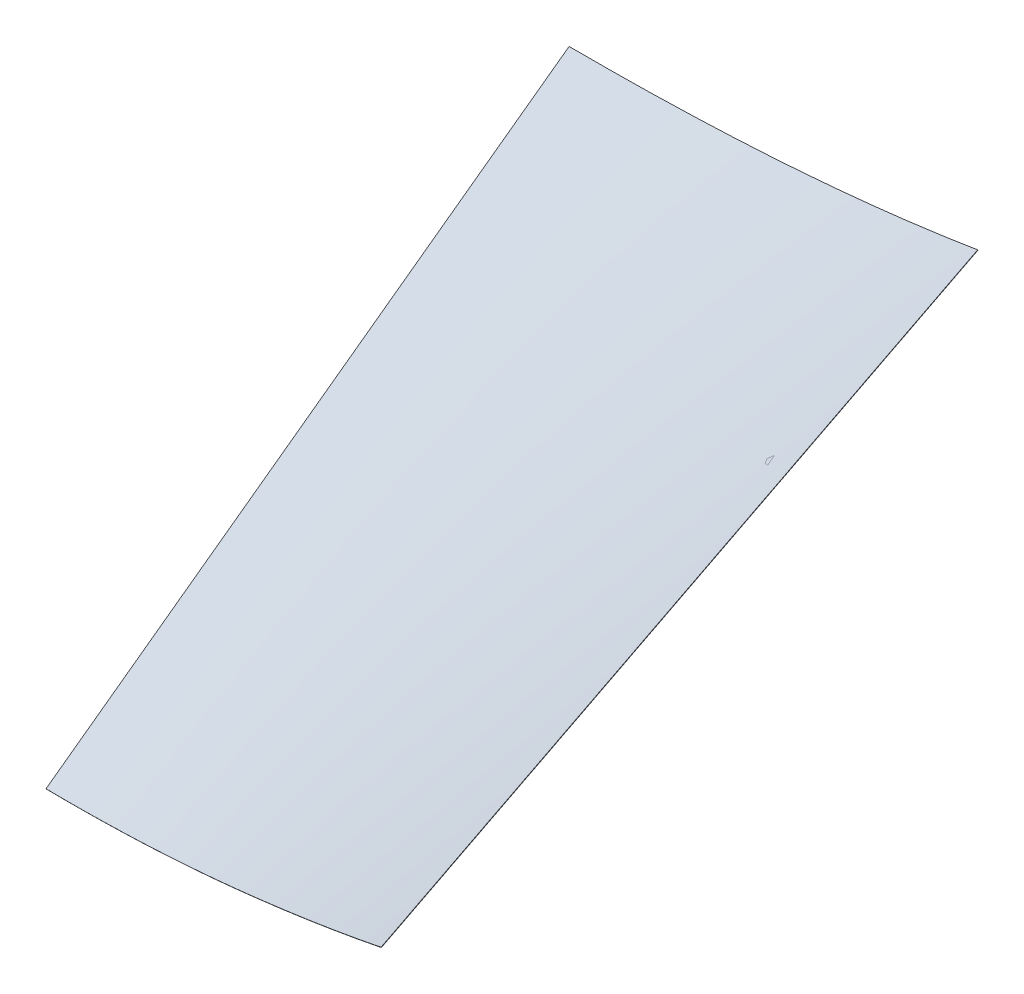
ISO-10303-21;
HEADER;
FILE_DESCRIPTION(('STEP AP214'),'2;1');
FILE_NAME('part.step','',(''),(''),'','','');
FILE_SCHEMA(('AUTOMOTIVE_DESIGN { 1 0 10303 214 1 1 1 1 }'));
ENDSEC;
DATA;
#1=APPLICATION_CONTEXT('core data for automotive mechanical design processes');
#2=APPLICATION_PROTOCOL_DEFINITION('international standard','automotive_design',2000,#1);
#3=PRODUCT_CONTEXT('',#1,'mechanical');
#4=PRODUCT('Part','Part','',(#3));
#5=PRODUCT_RELATED_PRODUCT_CATEGORY('part','',(#4));
#6=PRODUCT_DEFINITION_FORMATION('','',#4);
#7=PRODUCT_DEFINITION_CONTEXT('part definition',#1,'design');
#8=PRODUCT_DEFINITION('design','',#6,#7);
#9=PRODUCT_DEFINITION_SHAPE('','',#8);
#10=(LENGTH_UNIT() NAMED_UNIT(*) SI_UNIT(.MILLI.,.METRE.));
#11=(NAMED_UNIT(*) PLANE_ANGLE_UNIT() SI_UNIT($,.RADIAN.));
#12=(NAMED_UNIT(*) SI_UNIT($,.STERADIAN.) SOLID_ANGLE_UNIT());
#13=UNCERTAINTY_MEASURE_WITH_UNIT(LENGTH_MEASURE(1.E-05),#10,'distance_accuracy_value','');
#14=(GEOMETRIC_REPRESENTATION_CONTEXT(3) GLOBAL_UNCERTAINTY_ASSIGNED_CONTEXT((#13)) GLOBAL_UNIT_ASSIGNED_CONTEXT((#10,
#11,#12)) REPRESENTATION_CONTEXT('',''));
#15=CARTESIAN_POINT('',(0.,0.,0.));
#16=DIRECTION('',(0.,0.,1.));
#17=DIRECTION('',(1.,0.,0.));
#18=AXIS2_PLACEMENT_3D('',#15,#16,#17);
#19=CARTESIAN_POINT('',(-38.1499886062801,-1161.0080507242,1107.07655239869));
#20=CARTESIAN_POINT('',(-28.3698605992159,-1161.49242844966,1106.7179892266));
#21=CARTESIAN_POINT('',(-18.5803893052874,-1161.83673353649,1106.46310877334));
#22=CARTESIAN_POINT('',(1.01817256580119,-1162.23015300503,1106.17185441453));
#23=CARTESIAN_POINT('',(10.8276556057234,-1162.27729652267,1106.13693988012));
#24=CARTESIAN_POINT('',(40.2795059807348,-1161.9790850881,1106.35762286069));
#25=CARTESIAN_POINT('',(59.9451526862877,-1161.19744574197,1106.93616154347));
#26=CARTESIAN_POINT('',(118.976834691719,-1157.24545948258,1109.86126642328));
#27=CARTESIAN_POINT('',(158.3775793792,-1152.4680674079,1113.39730016528));
#28=CARTESIAN_POINT('',(276.252502196664,-1132.8384308102,1127.92572399571));
#29=CARTESIAN_POINT('',(354.399459277357,-1112.68894982968,1142.83817079136));
#30=CARTESIAN_POINT('',(469.104995003831,-1076.38776027423,1169.70226736042));
#31=CARTESIAN_POINT('',(506.921029003011,-1063.27447399166,1179.40627375934));
#32=CARTESIAN_POINT('',(553.473194657516,-1046.08704206374,1192.12484661789));
#33=CARTESIAN_POINT('',(562.747733192783,-1042.60976408366,1194.6979899312));
#34=CARTESIAN_POINT('',(581.220169268713,-1035.58738084722,1199.8944339847));
#35=CARTESIAN_POINT('',(590.417591559904,-1032.04305200869,1202.51715968828));
#36=CARTESIAN_POINT('',(617.895384255526,-1021.31418635607,1210.4562249209));
#37=CARTESIAN_POINT('',(636.061814422847,-1014.03275523264,1215.8442071235));
#38=CARTESIAN_POINT('',(726.176434926162,-976.994662944125,1243.25060966637));
#39=CARTESIAN_POINT('',(795.972024077284,-945.345133882044,1266.66842263182));
#40=CARTESIAN_POINT('',(864.021551677036,-911.847212487094,1291.45250542573));
#41=CARTESIAN_POINT('',(-38.1000000001121,-1160.35247008225,1107.55442162887));
#42=CARTESIAN_POINT('',(-28.3295038712985,-1160.83653412831,1107.19643569007));
#43=CARTESIAN_POINT('',(-18.5499374122105,-1161.18060655798,1106.94197950239));
#44=CARTESIAN_POINT('',(1.02830843663519,-1161.57376215261,1106.65122422779));
#45=CARTESIAN_POINT('',(10.8274162262114,-1161.62088017615,1106.61637844647));
#46=CARTESIAN_POINT('',(40.2492727833644,-1161.32290472367,1106.83674396001));
#47=CARTESIAN_POINT('',(59.8958265114803,-1160.54182222729,1107.41438766858));
#48=CARTESIAN_POINT('',(118.873099558641,-1156.59232326558,1110.33521003725));
#49=CARTESIAN_POINT('',(158.2414307405,-1151.81765532767,1113.86627994035));
#50=CARTESIAN_POINT('',(276.030182079502,-1132.19700651634,1128.37658377676));
#51=CARTESIAN_POINT('',(354.134360030071,-1112.05438064529,1143.2729118372));
#52=CARTESIAN_POINT('',(468.791383911466,-1075.76059541417,1170.11370880274));
#53=CARTESIAN_POINT('',(506.593851364521,-1062.64935926637,1179.8100252704));
#54=CARTESIAN_POINT('',(553.131806022483,-1045.46382978179,1192.5194548519));
#55=CARTESIAN_POINT('',(562.403640471157,-1041.98689966988,1195.09079246804));
#56=CARTESIAN_POINT('',(580.870935052068,-1034.96514477538,1200.28367869539));
#57=CARTESIAN_POINT('',(590.065899335466,-1031.42110420181,1202.90464735069));
#58=CARTESIAN_POINT('',(617.536271038952,-1020.69317464022,1210.83840728754));
#59=CARTESIAN_POINT('',(635.697834433342,-1013.41240691151,1216.22284451598));
#60=CARTESIAN_POINT('',(725.788559645226,-976.377799013707,1243.61151133465));
#61=CARTESIAN_POINT('',(795.566446182503,-944.731651081751,1267.01518295429));
#62=CARTESIAN_POINT('',(863.59999999974,-911.237335089981,1291.78565341665));
#63=B_SPLINE_SURFACE_WITH_KNOTS('',1,3,((#19,#20,#21,#22,#23,#24,#25,#26,#27,#28,#29,#30,#31,
#32,#33,#34,#35,#36,#37,#38,#39,#40),(#41,#42,#43,#44,#45,#46,#47,#48,#49,#50,#51,#52,#53,#54,
#55,#56,#57,#58,#59,#60,#61,#62)),.UNSPECIFIED.,.F.,.F.,.F.,(2,2),(4,2,2,2,2,2,2,2,2,2,4),(0.,
1.),(0.,0.03125,0.0625,0.125,0.25,0.5,0.625,0.65625,0.6875,0.75,1.),.UNSPECIFIED.);
#64=CARTESIAN_POINT('',(863.59999999974,-911.237335089981,1291.78565341665));
#65=CARTESIAN_POINT('',(864.021551677036,-911.847212487094,1291.45250542573));
#66=B_SPLINE_CURVE_WITH_KNOTS('',1,(#64,#65),.UNSPECIFIED.,.F.,.F.,(2,2),(0.,1.),.UNSPECIFIED.);
#67=CARTESIAN_POINT('',(863.59999999974,-911.237335089981,1291.78565341665));
#68=VERTEX_POINT('',#67);
#69=CARTESIAN_POINT('',(864.021551677036,-911.847212487094,1291.45250542573));
#70=VERTEX_POINT('',#69);
#71=EDGE_CURVE('E14',#68,#70,#66,.T.);
#72=CARTESIAN_POINT('',(863.59999999974,-911.237335089981,1291.78565341665));
#73=CARTESIAN_POINT('',(795.566446182503,-944.731651081751,1267.01518295429));
#74=CARTESIAN_POINT('',(725.788559645226,-976.377799013707,1243.61151133465));
#75=CARTESIAN_POINT('',(635.697834433342,-1013.41240691151,1216.22284451598));
#76=CARTESIAN_POINT('',(617.536271038952,-1020.69317464022,1210.83840728754));
#77=CARTESIAN_POINT('',(590.065899335466,-1031.42110420181,1202.90464735069));
#78=CARTESIAN_POINT('',(580.870935052068,-1034.96514477538,1200.28367869539));
#79=CARTESIAN_POINT('',(562.403640471157,-1041.98689966988,1195.09079246804));
#80=CARTESIAN_POINT('',(553.131806022483,-1045.46382978179,1192.5194548519));
#81=CARTESIAN_POINT('',(506.593851364521,-1062.64935926637,1179.8100252704));
#82=CARTESIAN_POINT('',(468.791383911466,-1075.76059541417,1170.11370880274));
#83=CARTESIAN_POINT('',(354.134360030071,-1112.05438064529,1143.2729118372));
#84=CARTESIAN_POINT('',(276.030182079502,-1132.19700651634,1128.37658377676));
#85=CARTESIAN_POINT('',(158.2414307405,-1151.81765532767,1113.86627994035));
#86=CARTESIAN_POINT('',(118.873099558641,-1156.59232326558,1110.33521003725));
#87=CARTESIAN_POINT('',(59.8958265114803,-1160.54182222729,1107.41438766858));
#88=CARTESIAN_POINT('',(40.2492727833644,-1161.32290472367,1106.83674396001));
#89=CARTESIAN_POINT('',(10.8274162262114,-1161.62088017615,1106.61637844647));
#90=CARTESIAN_POINT('',(1.02830843663519,-1161.57376215261,1106.65122422779));
#91=CARTESIAN_POINT('',(-18.5499374122105,-1161.18060655798,1106.94197950239));
#92=CARTESIAN_POINT('',(-28.3295038712985,-1160.83653412831,1107.19643569007));
#93=CARTESIAN_POINT('',(-38.1000000001121,-1160.35247008225,1107.55442162887));
#94=B_SPLINE_CURVE_WITH_KNOTS('',3,(#72,#73,#74,#75,#76,#77,#78,#79,#80,#81,#82,#83,#84,#85,#86,
#87,#88,#89,#90,#91,#92,#93),.UNSPECIFIED.,.F.,.F.,(4,2,2,2,2,2,2,2,2,2,4),(0.,0.25,0.3125,
0.34375,0.375,0.5,0.75,0.875,0.9375,0.96875,1.),.UNSPECIFIED.);
#95=CARTESIAN_POINT('',(-38.1000000001121,-1160.35247008225,1107.55442162887));
#96=VERTEX_POINT('',#95);
#97=EDGE_CURVE('E124',#68,#96,#94,.T.);
#98=CARTESIAN_POINT('',(-38.1000000001121,-1160.35247008225,1107.55442162887));
#99=CARTESIAN_POINT('',(-38.1499886062801,-1161.0080507242,1107.07655239869));
#100=B_SPLINE_CURVE_WITH_KNOTS('',1,(#98,#99),.UNSPECIFIED.,.F.,.F.,(2,2),(0.,1.),.UNSPECIFIED.);
#101=CARTESIAN_POINT('',(-38.149988136834,-1161.00805074745,1107.07655238148));
#102=VERTEX_POINT('',#101);
#103=EDGE_CURVE('E73',#96,#102,#100,.T.);
#104=CARTESIAN_POINT('',(864.021551677022,-911.847212487096,1291.45250542571));
#105=CARTESIAN_POINT('',(846.991448379126,-920.230675321087,1285.2498389563));
#106=CARTESIAN_POINT('',(829.866994424443,-928.490476265819,1279.13858601375));
#107=CARTESIAN_POINT('',(795.383151194075,-944.774409960295,1267.09028737735));
#108=CARTESIAN_POINT('',(778.023250665233,-952.797842713063,1261.15375916611));
#109=CARTESIAN_POINT('',(743.051081954765,-968.603840753451,1249.45875947928));
#110=CARTESIAN_POINT('',(725.438124779831,-976.385422056958,1243.70101546652));
#111=CARTESIAN_POINT('',(698.848755893684,-987.859615103853,1235.21091243888));
#112=CARTESIAN_POINT('',(689.94237363754,-991.657459460077,1232.40075127906));
#113=CARTESIAN_POINT('',(672.060075896384,-999.190902042924,1226.82644542188));
#114=CARTESIAN_POINT('',(663.084041236822,-1002.92631759315,1224.06243578743));
#115=CARTESIAN_POINT('',(645.06035606368,-1010.33426402736,1218.58091200075));
#116=CARTESIAN_POINT('',(636.01257567951,-1014.00659064761,1215.86354889298));
#117=CARTESIAN_POINT('',(617.843190241421,-1021.28762340955,1210.47586188345));
#118=CARTESIAN_POINT('',(608.721444467279,-1024.8961026206,1207.80570578767));
#119=CARTESIAN_POINT('',(590.402246312967,-1032.04914643048,1202.51264968553));
#120=CARTESIAN_POINT('',(581.204643704044,-1035.59346231094,1199.88993359581));
#121=CARTESIAN_POINT('',(562.734039897776,-1042.61478973817,1194.69427124228));
#122=CARTESIAN_POINT('',(553.460892132033,-1046.09155241528,1192.12150902913));
#123=CARTESIAN_POINT('',(539.505001291604,-1051.24422673472,1188.30856797985));
#124=CARTESIAN_POINT('',(534.840971836436,-1052.95293742014,1187.04413050022));
#125=CARTESIAN_POINT('',(525.495591829538,-1056.34902951643,1184.53103078738));
#126=CARTESIAN_POINT('',(520.814229054208,-1058.03638918663,1183.28238463427));
#127=CARTESIAN_POINT('',(506.740892559966,-1063.06573490379,1179.56065639225));
#128=CARTESIAN_POINT('',(497.328878636977,-1066.37158323478,1177.11430376876));
#129=CARTESIAN_POINT('',(478.442748406051,-1072.88033947338,1172.29774252344));
#130=CARTESIAN_POINT('',(468.968596263537,-1076.08318026447,1169.92758354745));
#131=CARTESIAN_POINT('',(449.963103850289,-1082.37402030492,1165.2722180213));
#132=CARTESIAN_POINT('',(440.431771765182,-1085.46203555712,1162.98699963328));
#133=CARTESIAN_POINT('',(411.777911454569,-1094.53027025539,1156.27620205165));
#134=CARTESIAN_POINT('',(392.563923814881,-1100.32563540825,1151.98737228626));
#135=CARTESIAN_POINT('',(353.962935798839,-1111.31489451913,1143.8547082633));
#136=CARTESIAN_POINT('',(334.577026948813,-1116.5112550784,1140.00904912407));
#137=CARTESIAN_POINT('',(295.669931846597,-1126.20671155027,1132.83364498383));
#138=CARTESIAN_POINT('',(276.150372612544,-1130.71000287455,1129.5007957818));
#139=CARTESIAN_POINT('',(237.012284181131,-1138.92364493373,1123.42185382362));
#140=CARTESIAN_POINT('',(217.395682444697,-1142.63984892252,1120.67142983547));
#141=CARTESIAN_POINT('',(187.866856611153,-1147.55722223888,1117.03194925589));
#142=CARTESIAN_POINT('',(178.037365473094,-1149.08311626113,1115.90258437016));
#143=CARTESIAN_POINT('',(158.368966137301,-1151.90151278489,1113.81658120073));
#144=CARTESIAN_POINT('',(148.530270968612,-1153.19496881825,1112.85923723617));
#145=CARTESIAN_POINT('',(128.848563122078,-1155.53663711402,1111.12605496591));
#146=CARTESIAN_POINT('',(119.005730741081,-1156.58582539044,1110.34949431015));
#147=CARTESIAN_POINT('',(99.3206436353137,-1158.42716932139,1108.98661119996));
#148=CARTESIAN_POINT('',(89.4785284342422,-1159.22028516715,1108.39957807709));
#149=CARTESIAN_POINT('',(69.7994676197702,-1160.5377237854,1107.42446180583));
#150=CARTESIAN_POINT('',(59.9626164847236,-1161.06294391689,1107.0357144679));
#151=CARTESIAN_POINT('',(45.2057165027884,-1161.64079078829,1106.60802011264));
#152=CARTESIAN_POINT('',(40.2917528202373,-1161.79835230299,1106.49140187025));
#153=CARTESIAN_POINT('',(30.4670274877195,-1162.04198384417,1106.31108317932));
#154=CARTESIAN_POINT('',(25.556269258543,-1162.12814096348,1106.24731826491));
#155=CARTESIAN_POINT('',(15.7386306820452,-1162.22759358792,1106.17372112805));
#156=CARTESIAN_POINT('',(10.8317515026811,-1162.24096349057,1106.16383383603));
#157=CARTESIAN_POINT('',(1.0224922870287,-1162.1930169901,1106.19934339257));
#158=CARTESIAN_POINT('',(-3.87988819287532,-1162.13176066596,1106.24469576959));
#159=CARTESIAN_POINT('',(-13.6797366638892,-1161.93517786812,1106.39022892732));
#160=CARTESIAN_POINT('',(-18.5772058819173,-1161.79989056784,1106.49038071097));
#161=CARTESIAN_POINT('',(-28.3673552104501,-1161.45738593482,1106.74392793311));
#162=CARTESIAN_POINT('',(-33.2600360356875,-1161.25018182601,1106.89731358304));
#163=CARTESIAN_POINT('',(-38.1499881368117,-1161.00805074746,1107.07655238149));
#164=B_SPLINE_CURVE_WITH_KNOTS('',3,(#104,#105,#106,#107,#108,#109,#110,#111,#112,#113,#114,
#115,#116,#117,#118,#119,#120,#121,#122,#123,#124,#125,#126,#127,#128,#129,#130,#131,#132,#133,
#134,#135,#136,#137,#138,#139,#140,#141,#142,#143,#144,#145,#146,#147,#148,#149,#150,#151,#152,
#153,#154,#155,#156,#157,#158,#159,#160,#161,#162,#163),.UNSPECIFIED.,.F.,.F.,(4,2,2,2,2,2,2,2,
2,2,2,2,2,2,2,2,2,2,2,2,2,2,2,2,2,2,2,2,2,4),(0.,59.9078035301592,119.97810147105,
180.267239793652,210.512462204246,240.83453309363,271.241107909605,301.739972295622,
332.338962432425,363.034916755443,378.411599361161,393.802849602651,424.615753662604,
455.448343645604,486.276620366178,547.829987864584,609.120078002313,670.023178250112,
730.456094651352,760.486084552519,790.389920693558,820.17213768124,849.841347553648,
879.410512087185,894.163468452529,908.898403858307,923.618275510888,938.326304535497,
953.026558336055,967.724110510313),.UNSPECIFIED.);
#165=EDGE_CURVE('E301',#70,#102,#164,.T.);
#166=ORIENTED_EDGE('',*,*,#71,.F.);
#167=ORIENTED_EDGE('',*,*,#97,.T.);
#168=ORIENTED_EDGE('',*,*,#103,.T.);
#169=ORIENTED_EDGE('',*,*,#165,.F.);
#170=EDGE_LOOP('',(#166,#167,#168,#169));
#171=FACE_BOUND('',#170,.T.);
#172=ADVANCED_FACE('F59',(#171),#63,.F.);
#173=CARTESIAN_POINT('',(-38.1499886062801,-1161.0080507242,1107.07655239869));
#174=CARTESIAN_POINT('',(-38.1367174604385,-888.835354328298,733.686086637298));
#175=CARTESIAN_POINT('',(-38.1238502804513,-616.662374036575,360.295827814729));
#176=CARTESIAN_POINT('',(-38.1113921318659,-344.489157937577,-13.0942591219789));
#177=CARTESIAN_POINT('',(-38.1000000001121,-1160.35247008225,1107.55442162887));
#178=CARTESIAN_POINT('',(-38.0999999998941,-888.179112865116,734.164437556715));
#179=CARTESIAN_POINT('',(-38.0999999996761,-616.005755647983,360.774453484564));
#180=CARTESIAN_POINT('',(-38.0999999994581,-343.832398430848,-12.6155305875886));
#181=B_SPLINE_SURFACE_WITH_KNOTS('',1,3,((#173,#174,#175,#176),(#177,#178,#179,#180)),
.UNSPECIFIED.,.F.,.F.,.F.,(2,2),(4,4),(0.,1.),(-0.693088332981127,0.693088332981127),.UNSPECIFIED.);
#182=CARTESIAN_POINT('',(-38.1000000001121,-1160.35247008225,1107.55442162887));
#183=CARTESIAN_POINT('',(-38.0999999998941,-888.179112865116,734.164437556715));
#184=CARTESIAN_POINT('',(-38.0999999996761,-616.005755647983,360.774453484564));
#185=CARTESIAN_POINT('',(-38.0999999994581,-343.832398430848,-12.6155305875886));
#186=B_SPLINE_CURVE_WITH_KNOTS('',3,(#182,#183,#184,#185),.UNSPECIFIED.,.F.,.F.,(4,4),
(-0.693088332981127,0.693088332981127),.UNSPECIFIED.);
#187=CARTESIAN_POINT('',(-38.0999999994581,-343.832398430848,-12.6155305875886));
#188=VERTEX_POINT('',#187);
#189=EDGE_CURVE('E299',#96,#188,#186,.T.);
#190=CARTESIAN_POINT('',(-38.0999999994581,-343.832398430848,-12.6155305875886));
#191=CARTESIAN_POINT('',(-38.1113921318659,-344.489157937577,-13.0942591219789));
#192=B_SPLINE_CURVE_WITH_KNOTS('',1,(#190,#191),.UNSPECIFIED.,.F.,.F.,(2,2),(0.,1.),.UNSPECIFIED.);
#193=CARTESIAN_POINT('',(-38.1113921318846,-344.489158345837,-13.0942585618937));
#194=VERTEX_POINT('',#193);
#195=EDGE_CURVE('E113',#188,#194,#192,.T.);
#196=CARTESIAN_POINT('',(-38.1499886061275,-1161.00805072421,1107.07655239868));
#197=CARTESIAN_POINT('',(-38.1483297117881,-1126.98646369153,1060.40274420222));
#198=CARTESIAN_POINT('',(-38.1466771157453,-1092.96487221842,1013.72893924227));
#199=CARTESIAN_POINT('',(-38.143384556249,-1024.92168058453,920.381335655025));
#200=CARTESIAN_POINT('',(-38.1417445927954,-990.900080423751,873.707537027737));
#201=CARTESIAN_POINT('',(-38.1384773344729,-922.856871607525,780.359945965148));
#202=CARTESIAN_POINT('',(-38.1368500396041,-888.835262952076,733.686153529848));
#203=CARTESIAN_POINT('',(-38.1336081462791,-820.792037337241,640.338574712181));
#204=CARTESIAN_POINT('',(-38.131993547823,-786.770420377856,593.664788329814));
#205=CARTESIAN_POINT('',(-38.1287770702163,-718.72717834414,500.317221480288));
#206=CARTESIAN_POINT('',(-38.1271751910657,-684.705553269811,453.64344101313));
#207=CARTESIAN_POINT('',(-38.1239841682166,-616.662295193144,360.29588585772));
#208=CARTESIAN_POINT('',(-38.1223950245179,-582.640662190807,313.622111169468));
#209=CARTESIAN_POINT('',(-38.119229484061,-514.597388443191,220.27456743699));
#210=CARTESIAN_POINT('',(-38.1176530873026,-480.575747697912,173.600798392765));
#211=CARTESIAN_POINT('',(-38.1145130450608,-412.532458646771,80.2532658154118));
#212=CARTESIAN_POINT('',(-38.1129493995773,-378.510810340909,33.5795022822832));
#213=CARTESIAN_POINT('',(-38.1113921318987,-344.489158345833,-13.0942585618997));
#214=B_SPLINE_CURVE_WITH_KNOTS('',3,(#196,#197,#198,#199,#200,#201,#202,#203,#204,#205,#206,
#207,#208,#209,#210,#211,#212,#213),.UNSPECIFIED.,.F.,.F.,(4,2,2,2,2,2,2,2,4),(0.,
173.272083229835,346.544166458521,519.816249686068,693.088332912546,866.360416137876,
1039.63249936217,1212.90458258539,1386.17666580757),.UNSPECIFIED.);
#215=EDGE_CURVE('E134',#102,#194,#214,.T.);
#216=ORIENTED_EDGE('',*,*,#103,.F.);
#217=ORIENTED_EDGE('',*,*,#189,.T.);
#218=ORIENTED_EDGE('',*,*,#195,.T.);
#219=ORIENTED_EDGE('',*,*,#215,.F.);
#220=EDGE_LOOP('',(#216,#217,#218,#219));
#221=FACE_BOUND('',#220,.T.);
#222=ADVANCED_FACE('F158',(#221),#181,.T.);
#223=CARTESIAN_POINT('',(-38.1113921318659,-344.489157937577,-13.0942591219789));
#224=CARTESIAN_POINT('',(2.34657230488643,-344.986214440813,-13.3751195559739));
#225=CARTESIAN_POINT('',(42.7240325935585,-344.690919388901,-13.2088396489773));
#226=CARTESIAN_POINT('',(123.319431538469,-342.531221424864,-11.9910711773869));
#227=CARTESIAN_POINT('',(163.537404802124,-340.66709860637,-10.9397911469516));
#228=CARTESIAN_POINT('',(243.815031871022,-335.380517780352,-7.95883000248485));
#229=CARTESIAN_POINT('',(283.87460751026,-331.957398895512,-6.02877801816092));
#230=CARTESIAN_POINT('',(363.835695568645,-323.555594827901,-1.29246599809944));
#231=CARTESIAN_POINT('',(403.737201367728,-318.57658801898,1.51397476011851));
#232=CARTESIAN_POINT('',(483.381545039883,-307.057062461361,8.00579681296864));
#233=CARTESIAN_POINT('',(523.124459564965,-300.517249069255,11.6907812971803));
#234=CARTESIAN_POINT('',(602.450448141265,-285.864225178705,19.9458083506498));
#235=CARTESIAN_POINT('',(642.033523790623,-277.75121211723,24.5157036959996));
#236=CARTESIAN_POINT('',(686.473519881027,-267.728843596813,30.1602980643572));
#237=CARTESIAN_POINT('',(691.410075870621,-266.602797557578,30.7944768649571));
#238=CARTESIAN_POINT('',(701.280475229855,-264.325813340226,32.0768339993813));
#239=CARTESIAN_POINT('',(706.213909004898,-263.174963169399,32.7249626464872));
#240=CARTESIAN_POINT('',(720.99568472751,-259.688505910376,34.6884174900149));
#241=CARTESIAN_POINT('',(730.824982307017,-257.319120664236,36.02273992793));
#242=CARTESIAN_POINT('',(760.245311682603,-250.074935639943,40.1022075537145));
#243=CARTESIAN_POINT('',(779.765728959614,-245.064777139743,42.9234758613329));
#244=CARTESIAN_POINT('',(838.051406324731,-229.499696853385,51.6879235407297));
#245=CARTESIAN_POINT('',(876.541207886824,-218.410297762879,57.9316760840266));
#246=CARTESIAN_POINT('',(914.671731224014,-206.62390026416,64.5673705536613));
#247=CARTESIAN_POINT('',(-38.0999999994581,-343.832398430848,-12.6155305875886));
#248=CARTESIAN_POINT('',(2.34587496324093,-344.329960485962,-12.8954097746801));
#249=CARTESIAN_POINT('',(42.7112630313482,-344.034662193241,-12.7293041698282));
#250=CARTESIAN_POINT('',(123.28255233771,-341.874093742574,-11.5139821101718));
#251=CARTESIAN_POINT('',(163.488503500891,-340.009130503825,-10.4649382977443));
#252=CARTESIAN_POINT('',(243.74209392101,-334.720431403832,-7.49003940892614));
#253=CARTESIAN_POINT('',(283.789666184797,-331.296035913818,-5.56381329064884));
#254=CARTESIAN_POINT('',(363.726817259782,-322.891607873523,-0.836313547232498));
#255=CARTESIAN_POINT('',(403.61636377478,-317.911257328022,1.96513895055722));
#256=CARTESIAN_POINT('',(483.236893543718,-306.38930872168,8.44624733996641));
#257=CARTESIAN_POINT('',(522.96794847311,-299.848416392546,12.1255062567464));
#258=CARTESIAN_POINT('',(602.270317030323,-285.193784982088,20.3687520672457));
#259=CARTESIAN_POINT('',(641.841651959498,-277.080255638372,24.9326209833358));
#260=CARTESIAN_POINT('',(686.268518660841,-267.057661205714,30.5703410496611));
#261=CARTESIAN_POINT('',(691.203617801813,-265.931594684339,31.2037546698792));
#262=CARTESIAN_POINT('',(701.071102104155,-263.654579892329,32.4845779208339));
#263=CARTESIAN_POINT('',(706.003082790505,-262.503718528302,33.1319386665097));
#264=CARTESIAN_POINT('',(720.780501091898,-259.017242407826,35.0930852056861));
#265=CARTESIAN_POINT('',(730.606904669383,-256.647862381244,36.4258639996762));
#266=CARTESIAN_POINT('',(760.01858174471,-249.403746737238,40.5006867816811));
#267=CARTESIAN_POINT('',(779.533270144511,-244.393706269023,43.318839892688));
#268=CARTESIAN_POINT('',(837.801907241688,-228.82918575632,52.0738992944013));
#269=CARTESIAN_POINT('',(876.280499312856,-217.740445285047,58.3113276454345));
#270=CARTESIAN_POINT('',(914.400000000373,-205.954978105115,64.9406655137625));
#271=B_SPLINE_SURFACE_WITH_KNOTS('',1,3,((#223,#224,#225,#226,#227,#228,#229,#230,#231,#232,
#233,#234,#235,#236,#237,#238,#239,#240,#241,#242,#243,#244,#245,#246),(#247,#248,#249,#250,
#251,#252,#253,#254,#255,#256,#257,#258,#259,#260,#261,#262,#263,#264,#265,#266,#267,#268,#269,
#270)),.UNSPECIFIED.,.F.,.F.,.F.,(2,2),(4,2,2,2,2,2,2,2,2,2,2,4),(0.,1.),(0.,0.125,0.25,0.375,
0.5,0.625,0.75,0.765625,0.78125,0.8125,0.875,1.),.UNSPECIFIED.);
#272=CARTESIAN_POINT('',(-38.0999999994581,-343.832398430848,-12.6155305875886));
#273=CARTESIAN_POINT('',(2.34587496324093,-344.329960485962,-12.8954097746801));
#274=CARTESIAN_POINT('',(42.7112630313482,-344.034662193241,-12.7293041698282));
#275=CARTESIAN_POINT('',(123.28255233771,-341.874093742574,-11.5139821101718));
#276=CARTESIAN_POINT('',(163.488503500891,-340.009130503825,-10.4649382977443));
#277=CARTESIAN_POINT('',(243.74209392101,-334.720431403832,-7.49003940892614));
#278=CARTESIAN_POINT('',(283.789666184797,-331.296035913818,-5.56381329064884));
#279=CARTESIAN_POINT('',(363.726817259782,-322.891607873523,-0.836313547232498));
#280=CARTESIAN_POINT('',(403.61636377478,-317.911257328022,1.96513895055722));
#281=CARTESIAN_POINT('',(483.236893543718,-306.38930872168,8.44624733996641));
#282=CARTESIAN_POINT('',(522.96794847311,-299.848416392546,12.1255062567464));
#283=CARTESIAN_POINT('',(602.270317030323,-285.193784982088,20.3687520672457));
#284=CARTESIAN_POINT('',(641.841651959498,-277.080255638372,24.9326209833358));
#285=CARTESIAN_POINT('',(686.268518660841,-267.057661205714,30.5703410496611));
#286=CARTESIAN_POINT('',(691.203617801813,-265.931594684339,31.2037546698792));
#287=CARTESIAN_POINT('',(701.071102104155,-263.654579892329,32.4845779208339));
#288=CARTESIAN_POINT('',(706.003082790505,-262.503718528302,33.1319386665097));
#289=CARTESIAN_POINT('',(720.780501091898,-259.017242407826,35.0930852056861));
#290=CARTESIAN_POINT('',(730.606904669383,-256.647862381244,36.4258639996762));
#291=CARTESIAN_POINT('',(760.01858174471,-249.403746737238,40.5006867816811));
#292=CARTESIAN_POINT('',(779.533270144511,-244.393706269023,43.318839892688));
#293=CARTESIAN_POINT('',(837.801907241688,-228.82918575632,52.0738992944013));
#294=CARTESIAN_POINT('',(876.280499312856,-217.740445285047,58.3113276454345));
#295=CARTESIAN_POINT('',(914.400000000373,-205.954978105115,64.9406655137625));
#296=B_SPLINE_CURVE_WITH_KNOTS('',3,(#272,#273,#274,#275,#276,#277,#278,#279,#280,#281,#282,
#283,#284,#285,#286,#287,#288,#289,#290,#291,#292,#293,#294,#295),.UNSPECIFIED.,.F.,.F.,(4,2,2,
2,2,2,2,2,2,2,2,4),(0.,0.125,0.25,0.375,0.5,0.625,0.75,0.765625,0.78125,0.8125,0.875,1.),.UNSPECIFIED.);
#297=CARTESIAN_POINT('',(914.400000000373,-205.954978105115,64.9406655137625));
#298=VERTEX_POINT('',#297);
#299=EDGE_CURVE('E122',#188,#298,#296,.T.);
#300=CARTESIAN_POINT('',(914.400000000373,-205.954978105115,64.9406655137625));
#301=CARTESIAN_POINT('',(914.671731224014,-206.62390026416,64.5673705536613));
#302=B_SPLINE_CURVE_WITH_KNOTS('',1,(#300,#301),.UNSPECIFIED.,.F.,.F.,(2,2),(0.,1.),.UNSPECIFIED.);
#303=CARTESIAN_POINT('',(914.671731224014,-206.62390026416,64.5673705536613));
#304=VERTEX_POINT('',#303);
#305=EDGE_CURVE('E101',#298,#304,#302,.T.);
#306=CARTESIAN_POINT('',(-38.1113921318907,-344.489157937565,-13.0942591219955));
#307=CARTESIAN_POINT('',(-17.9033691617553,-344.737446421296,-13.2345762260982));
#308=CARTESIAN_POINT('',(2.30689562068208,-344.788198069211,-13.2633965755896));
#309=CARTESIAN_POINT('',(42.6873452861214,-344.494817656354,-13.0982195002732));
#310=CARTESIAN_POINT('',(62.8575369590368,-344.151394679827,-12.9046221839948));
#311=CARTESIAN_POINT('',(123.279760528812,-342.532307290176,-11.9916849880168));
#312=CARTESIAN_POINT('',(163.513886353478,-340.668684891408,-10.9406856731595));
#313=CARTESIAN_POINT('',(223.744992132439,-336.702185928163,-8.70408319330163));
#314=CARTESIAN_POINT('',(243.795839613253,-335.185491071885,-7.84889770319673));
#315=CARTESIAN_POINT('',(283.858461188529,-331.762642050309,-5.91907647222119));
#316=CARTESIAN_POINT('',(303.870226142828,-329.856405752119,-4.84439445161607));
#317=CARTESIAN_POINT('',(343.85420975039,-325.655102970912,-2.47601243182307));
#318=CARTESIAN_POINT('',(363.82639042977,-323.359762470697,-1.18215808631554));
#319=CARTESIAN_POINT('',(403.73090150267,-318.379712371697,1.62479305275663));
#320=CARTESIAN_POINT('',(423.663155052166,-315.694537682804,3.13815172302588));
#321=CARTESIAN_POINT('',(483.460648953756,-307.045658236091,8.01222538033632));
#322=CARTESIAN_POINT('',(523.216993527604,-300.500121453223,11.7004411992467));
#323=CARTESIAN_POINT('',(602.571393494783,-285.841919279044,19.9583639236735));
#324=CARTESIAN_POINT('',(642.16743781806,-277.720989868905,24.5327190537381));
#325=CARTESIAN_POINT('',(701.293032557817,-264.386670819441,32.0426114895918));
#326=CARTESIAN_POINT('',(720.992963800885,-259.740086342909,34.6594067206427));
#327=CARTESIAN_POINT('',(760.214936272838,-250.082393084195,40.0980061878947));
#328=CARTESIAN_POINT('',(779.737323289698,-245.072353909255,42.9192088469441));
#329=CARTESIAN_POINT('',(818.597839566664,-234.694744077621,48.76267622057));
#330=CARTESIAN_POINT('',(837.936327528237,-229.328192673543,51.7843677181429));
#331=CARTESIAN_POINT('',(876.431333842716,-218.241854096732,58.0263922235112));
#332=CARTESIAN_POINT('',(895.588163472797,-212.522887866241,61.2462635565911));
#333=CARTESIAN_POINT('',(914.671731224003,-206.623900264167,64.567370553665));
#334=B_SPLINE_CURVE_WITH_KNOTS('',3,(#306,#307,#308,#309,#310,#311,#312,#313,#314,#315,#316,
#317,#318,#319,#320,#321,#322,#323,#324,#325,#326,#327,#328,#329,#330,#331,#332,#333),
.UNSPECIFIED.,.F.,.F.,(4,2,2,2,2,2,2,2,2,2,2,2,2,4),(0.,60.6269134077664,121.144935225039,
241.969804846965,302.344958819006,362.732855752902,423.163457421557,483.666757248646,
605.004331645517,726.996512084088,788.219236971001,849.268577885346,910.150326002856,
970.895252551683),.UNSPECIFIED.);
#335=EDGE_CURVE('E114',#194,#304,#334,.T.);
#336=ORIENTED_EDGE('',*,*,#195,.F.);
#337=ORIENTED_EDGE('',*,*,#299,.T.);
#338=ORIENTED_EDGE('',*,*,#305,.T.);
#339=ORIENTED_EDGE('',*,*,#335,.F.);
#340=EDGE_LOOP('',(#336,#337,#338,#339));
#341=FACE_BOUND('',#340,.T.);
#342=ADVANCED_FACE('F130',(#341),#271,.T.);
#343=CARTESIAN_POINT('',(914.671731224014,-206.62390026416,64.5673705536612));
#344=CARTESIAN_POINT('',(897.789522369137,-441.703190072608,473.526341695837));
#345=CARTESIAN_POINT('',(880.907226901501,-676.777342341912,882.488262685146));
#346=CARTESIAN_POINT('',(864.021551677036,-911.847212487094,1291.45250542573));
#347=CARTESIAN_POINT('',(914.400000000373,-205.954978105115,64.9406655137624));
#348=CARTESIAN_POINT('',(897.466666666828,-441.049097100071,473.888994814727));
#349=CARTESIAN_POINT('',(880.533333333284,-676.143216095026,882.83732411569));
#350=CARTESIAN_POINT('',(863.59999999974,-911.237335089981,1291.78565341665));
#351=B_SPLINE_SURFACE_WITH_KNOTS('',1,3,((#343,#344,#345,#346),(#347,#348,#349,#350)),
.UNSPECIFIED.,.F.,.F.,.F.,(2,2),(4,4),(0.,1.),(-0.708017031471814,0.708017031471814),.UNSPECIFIED.);
#352=CARTESIAN_POINT('',(914.400000000373,-205.954978105115,64.9406655137624));
#353=CARTESIAN_POINT('',(897.466666666828,-441.049097100071,473.888994814727));
#354=CARTESIAN_POINT('',(880.533333333284,-676.143216095026,882.83732411569));
#355=CARTESIAN_POINT('',(863.59999999974,-911.237335089981,1291.78565341665));
#356=B_SPLINE_CURVE_WITH_KNOTS('',3,(#352,#353,#354,#355),.UNSPECIFIED.,.F.,.F.,(4,4),
(-0.708017031471814,0.708017031471814),.UNSPECIFIED.);
#357=EDGE_CURVE('E103',#298,#68,#356,.T.);
#358=CARTESIAN_POINT('',(914.671731224003,-206.623900264167,64.567370553665));
#359=CARTESIAN_POINT('',(912.561455080038,-236.008811654166,115.6872418541));
#360=CARTESIAN_POINT('',(910.451177879665,-265.393644880201,166.807158041421));
#361=CARTESIAN_POINT('',(906.230608273017,-324.163155866032,269.047079160066));
#362=CARTESIAN_POINT('',(904.120315866741,-353.547833625827,320.16708409139));
#363=CARTESIAN_POINT('',(899.89970275544,-412.317034537513,422.407181662445));
#364=CARTESIAN_POINT('',(897.789382050413,-441.701557689403,473.527274302176));
#365=CARTESIAN_POINT('',(893.568699118673,-500.47045141367,575.767545576481));
#366=CARTESIAN_POINT('',(891.45833689196,-529.854821986046,626.887724211056));
#367=CARTESIAN_POINT('',(887.237557760221,-588.623413441805,729.128165268585));
#368=CARTESIAN_POINT('',(885.127140855196,-618.007634325187,780.248427691539));
#369=CARTESIAN_POINT('',(880.906239405035,-676.77593024776,882.489033578803));
#370=CARTESIAN_POINT('',(878.795754859899,-706.160005286951,933.609377043113));
#371=CARTESIAN_POINT('',(874.574705448588,-764.928014199705,1035.85014179848));
#372=CARTESIAN_POINT('',(872.464140582413,-794.311948073267,1086.97056308954));
#373=CARTESIAN_POINT('',(868.242918449767,-853.079680404484,1189.21147969281));
#374=CARTESIAN_POINT('',(866.132261183297,-882.463478862139,1240.33197500502));
#375=CARTESIAN_POINT('',(864.021551677022,-911.847212487096,1291.45250542571));
#376=B_SPLINE_CURVE_WITH_KNOTS('',3,(#358,#359,#360,#361,#362,#363,#364,#365,#366,#367,#368,
#369,#370,#371,#372,#373,#374,#375),.UNSPECIFIED.,.F.,.F.,(4,2,2,2,2,2,2,2,4),(0.,
177.004259048053,354.00851811346,531.012777193384,708.017036284922,885.021295384967,
1062.02555449022,1239.02981359757,1416.03407270358),.UNSPECIFIED.);
#377=EDGE_CURVE('E106',#304,#70,#376,.T.);
#378=ORIENTED_EDGE('',*,*,#357,.T.);
#379=ORIENTED_EDGE('',*,*,#71,.T.);
#380=ORIENTED_EDGE('',*,*,#377,.F.);
#381=ORIENTED_EDGE('',*,*,#305,.F.);
#382=EDGE_LOOP('',(#378,#379,#380,#381));
#383=FACE_BOUND('',#382,.T.);
#384=ADVANCED_FACE('F61',(#383),#351,.T.);
#385=CARTESIAN_POINT('',(-38.0999999994581,-343.832398430848,-12.6155305875886));
#386=CARTESIAN_POINT('',(-38.1000000001121,-1160.35247008225,1107.55442162887));
#387=CARTESIAN_POINT('',(-28.7083426162355,-343.947933880454,-12.6805194013127));
#388=CARTESIAN_POINT('',(-29.0250464143398,-1160.80207455398,1107.2219200101));
#389=CARTESIAN_POINT('',(-19.3210308192935,-344.020681765413,-12.7214401642524));
#390=CARTESIAN_POINT('',(-19.9422679304403,-1161.13090942816,1106.97873264244));
#391=CARTESIAN_POINT('',(-6.20613121425231,-344.062775369151,-12.7451178612849));
#392=CARTESIAN_POINT('',(-7.23549096559604,-1161.41332587001,1106.76987367864));
#393=CARTESIAN_POINT('',(48.1299604592439,-344.138989710631,-12.7879885097173));
#394=CARTESIAN_POINT('',(45.4383032727585,-1162.29155315382,1106.12038727031));
#395=CARTESIAN_POINT('',(102.320914979854,-342.786152846842,-12.0270163298395));
#396=CARTESIAN_POINT('',(98.3928648062514,-1158.83641370392,1108.67560976562));
#397=CARTESIAN_POINT('',(206.723480403001,-337.632292273125,-9.12796425597695));
#398=CARTESIAN_POINT('',(200.536690454124,-1145.90170749117,1118.24137484233));
#399=CARTESIAN_POINT('',(314.551170435439,-329.469660580371,-4.53647521614164));
#400=CARTESIAN_POINT('',(306.168932725831,-1125.54466595064,1133.29627240479));
#401=CARTESIAN_POINT('',(421.80721280286,-315.678464674774,3.22108720125591));
#402=CARTESIAN_POINT('',(410.00070697416,-1094.92267719467,1155.94253477853));
#403=CARTESIAN_POINT('',(516.915872669806,-300.903381686651,11.5320871527595));
#404=CARTESIAN_POINT('',(500.84662297987,-1064.75960042307,1178.24941223226));
#405=CARTESIAN_POINT('',(570.288670991357,-291.49480527502,16.8244214268642));
#406=CARTESIAN_POINT('',(551.289138566535,-1046.51226411041,1191.74409309872));
#407=CARTESIAN_POINT('',(623.516525649683,-280.659082798377,22.9195268858509));
#408=CARTESIAN_POINT('',(600.608584972646,-1027.32575279791,1205.9333338003));
#409=CARTESIAN_POINT('',(648.611703073554,-275.397587620824,25.8791235392588));
#410=CARTESIAN_POINT('',(623.761560982581,-1018.17741673166,1212.69891720151));
#411=CARTESIAN_POINT('',(661.901518528545,-272.519812091193,27.4978753463675));
#412=CARTESIAN_POINT('',(635.963346755523,-1013.27137862984,1216.32714092515));
#413=CARTESIAN_POINT('',(681.822544875401,-268.068286846681,30.0018630478913));
#414=CARTESIAN_POINT('',(654.168139326011,-1005.82656405026,1221.83289777317));
#415=CARTESIAN_POINT('',(688.460604106029,-266.561967328477,30.8491693847024));
#416=CARTESIAN_POINT('',(660.22008916802,-1003.33066628592,1223.67872026627));
#417=CARTESIAN_POINT('',(701.7321456225,-263.504262722466,32.5691314893282));
#418=CARTESIAN_POINT('',(672.292013892246,-998.310487228495,1227.39135607851));
#419=CARTESIAN_POINT('',(708.365291646703,-261.952930171496,33.441757705116));
#420=CARTESIAN_POINT('',(678.311988774463,-995.786205935405,1229.25816939766));
#421=CARTESIAN_POINT('',(741.464219524792,-254.096718335888,37.8608852482387));
#422=CARTESIAN_POINT('',(708.333560127351,-983.094346348566,1238.64433907151));
#423=CARTESIAN_POINT('',(767.773992421667,-247.483130042554,41.5810357224762));
#424=CARTESIAN_POINT('',(732.100247423444,-972.715408690653,1246.32000466053));
#425=CARTESIAN_POINT('',(834.475231350708,-229.786370778692,51.535481697633));
#426=CARTESIAN_POINT('',(792.15151874874,-945.67639575914,1266.31650410587));
#427=CARTESIAN_POINT('',(874.633016272073,-218.249800259704,58.0248149285125));
#428=CARTESIAN_POINT('',(828.113055275483,-928.708286899581,1278.86514189299));
#429=CARTESIAN_POINT('',(914.400000000373,-205.954978105115,64.9406655137625));
#430=CARTESIAN_POINT('',(863.59999999974,-911.237335089981,1291.78565341665));
#431=B_SPLINE_SURFACE_WITH_KNOTS('',3,1,((#385,#386),(#387,#388),(#389,#390),(#391,#392),(#393,
#394),(#395,#396),(#397,#398),(#399,#400),(#401,#402),(#403,#404),(#405,#406),(#407,#408),(#409,
#410),(#411,#412),(#413,#414),(#415,#416),(#417,#418),(#419,#420),(#421,#422),(#423,#424),(#425,
#426),(#427,#428),(#429,#430)),.UNSPECIFIED.,.F.,.F.,.F.,(4,2,1,2,1,2,1,2,2,2,2,2,4),(2,2),(0.,
0.0290253735139468,0.0405697101684278,0.197139826211129,0.365254278908314,0.533368731605497,
0.664203355163174,0.701483184302679,0.743511797476974,0.764526104064123,0.785540410651272,
0.869597636999864,1.),(0.,1.),.UNSPECIFIED.);
#432=OFFSET_SURFACE('',#431,0.8128,.F.);
#433=ORIENTED_EDGE('',*,*,#335,.T.);
#434=ORIENTED_EDGE('',*,*,#377,.T.);
#435=ORIENTED_EDGE('',*,*,#165,.T.);
#436=ORIENTED_EDGE('',*,*,#215,.T.);
#437=EDGE_LOOP('',(#433,#434,#435,#436));
#438=FACE_BOUND('',#437,.T.);
#439=ADVANCED_FACE('F159',(#438),#432,.T.);
#440=CARTESIAN_POINT('',(-38.0999999994581,-343.832398430848,-12.6155305875886));
#441=CARTESIAN_POINT('',(-38.1000000001121,-1160.35247008225,1107.55442162887));
#442=CARTESIAN_POINT('',(-28.7083426162355,-343.947933880454,-12.6805194013127));
#443=CARTESIAN_POINT('',(-29.0250464143398,-1160.80207455398,1107.2219200101));
#444=CARTESIAN_POINT('',(-19.3210308192935,-344.020681765413,-12.7214401642524));
#445=CARTESIAN_POINT('',(-19.9422679304403,-1161.13090942816,1106.97873264244));
#446=CARTESIAN_POINT('',(-6.20613121425231,-344.062775369151,-12.7451178612849));
#447=CARTESIAN_POINT('',(-7.23549096559604,-1161.41332587001,1106.76987367864));
#448=CARTESIAN_POINT('',(48.1299604592439,-344.138989710631,-12.7879885097173));
#449=CARTESIAN_POINT('',(45.4383032727585,-1162.29155315382,1106.12038727031));
#450=CARTESIAN_POINT('',(102.320914979854,-342.786152846842,-12.0270163298395));
#451=CARTESIAN_POINT('',(98.3928648062514,-1158.83641370392,1108.67560976562));
#452=CARTESIAN_POINT('',(206.723480403001,-337.632292273125,-9.12796425597695));
#453=CARTESIAN_POINT('',(200.536690454124,-1145.90170749117,1118.24137484233));
#454=CARTESIAN_POINT('',(314.551170435439,-329.469660580371,-4.53647521614164));
#455=CARTESIAN_POINT('',(306.168932725831,-1125.54466595064,1133.29627240479));
#456=CARTESIAN_POINT('',(421.80721280286,-315.678464674774,3.22108720125591));
#457=CARTESIAN_POINT('',(410.00070697416,-1094.92267719467,1155.94253477853));
#458=CARTESIAN_POINT('',(516.915872669806,-300.903381686651,11.5320871527595));
#459=CARTESIAN_POINT('',(500.84662297987,-1064.75960042307,1178.24941223226));
#460=CARTESIAN_POINT('',(570.288670991357,-291.49480527502,16.8244214268642));
#461=CARTESIAN_POINT('',(551.289138566535,-1046.51226411041,1191.74409309872));
#462=CARTESIAN_POINT('',(623.516525649683,-280.659082798377,22.9195268858509));
#463=CARTESIAN_POINT('',(600.608584972646,-1027.32575279791,1205.9333338003));
#464=CARTESIAN_POINT('',(648.611703073554,-275.397587620824,25.8791235392588));
#465=CARTESIAN_POINT('',(623.761560982581,-1018.17741673166,1212.69891720151));
#466=CARTESIAN_POINT('',(661.901518528545,-272.519812091193,27.4978753463675));
#467=CARTESIAN_POINT('',(635.963346755523,-1013.27137862984,1216.32714092515));
#468=CARTESIAN_POINT('',(681.822544875401,-268.068286846681,30.0018630478913));
#469=CARTESIAN_POINT('',(654.168139326011,-1005.82656405026,1221.83289777317));
#470=CARTESIAN_POINT('',(688.460604106029,-266.561967328477,30.8491693847024));
#471=CARTESIAN_POINT('',(660.22008916802,-1003.33066628592,1223.67872026627));
#472=CARTESIAN_POINT('',(701.7321456225,-263.504262722466,32.5691314893282));
#473=CARTESIAN_POINT('',(672.292013892246,-998.310487228495,1227.39135607851));
#474=CARTESIAN_POINT('',(708.365291646703,-261.952930171496,33.441757705116));
#475=CARTESIAN_POINT('',(678.311988774463,-995.786205935405,1229.25816939766));
#476=CARTESIAN_POINT('',(741.464219524792,-254.096718335888,37.8608852482387));
#477=CARTESIAN_POINT('',(708.333560127351,-983.094346348566,1238.64433907151));
#478=CARTESIAN_POINT('',(767.773992421667,-247.483130042554,41.5810357224762));
#479=CARTESIAN_POINT('',(732.100247423444,-972.715408690653,1246.32000466053));
#480=CARTESIAN_POINT('',(834.475231350708,-229.786370778692,51.535481697633));
#481=CARTESIAN_POINT('',(792.15151874874,-945.67639575914,1266.31650410587));
#482=CARTESIAN_POINT('',(874.633016272073,-218.249800259704,58.0248149285125));
#483=CARTESIAN_POINT('',(828.113055275483,-928.708286899581,1278.86514189299));
#484=CARTESIAN_POINT('',(914.400000000373,-205.954978105115,64.9406655137625));
#485=CARTESIAN_POINT('',(863.59999999974,-911.237335089981,1291.78565341665));
#486=B_SPLINE_SURFACE_WITH_KNOTS('',3,1,((#440,#441),(#442,#443),(#444,#445),(#446,#447),(#448,
#449),(#450,#451),(#452,#453),(#454,#455),(#456,#457),(#458,#459),(#460,#461),(#462,#463),(#464,
#465),(#466,#467),(#468,#469),(#470,#471),(#472,#473),(#474,#475),(#476,#477),(#478,#479),(#480,
#481),(#482,#483),(#484,#485)),.UNSPECIFIED.,.F.,.F.,.F.,(4,2,1,2,1,2,1,2,2,2,2,2,4),(2,2),(0.,
0.0290253735139468,0.0405697101684278,0.197139826211129,0.365254278908314,0.533368731605497,
0.664203355163174,0.701483184302679,0.743511797476974,0.764526104064123,0.785540410651272,
0.869597636999864,1.),(0.,1.),.UNSPECIFIED.);
#487=ORIENTED_EDGE('',*,*,#299,.F.);
#488=ORIENTED_EDGE('',*,*,#189,.F.);
#489=ORIENTED_EDGE('',*,*,#97,.F.);
#490=ORIENTED_EDGE('',*,*,#357,.F.);
#491=EDGE_LOOP('',(#487,#488,#489,#490));
#492=FACE_BOUND('',#491,.T.);
#493=ADVANCED_FACE('F120',(#492),#486,.F.);
#494=CLOSED_SHELL('',(#172,#222,#342,#384,#439,#493));
#495=MANIFOLD_SOLID_BREP('B2',#494);
#496=ADVANCED_BREP_SHAPE_REPRESENTATION('',(#18,#495),#14);
#497=SHAPE_DEFINITION_REPRESENTATION(#9,#496);
ENDSEC;
END-ISO-10303-21;
